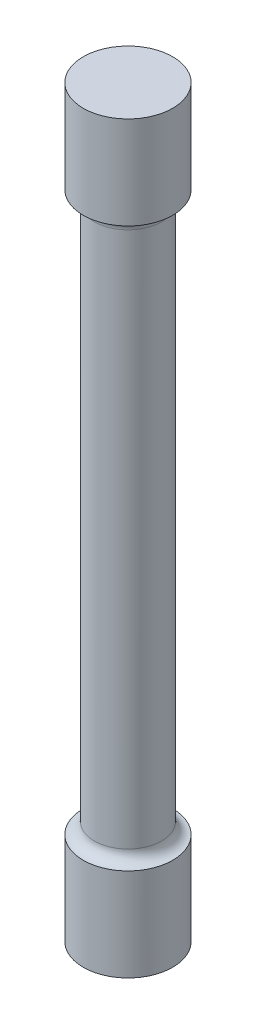
ISO-10303-21;
HEADER;
FILE_DESCRIPTION(('STEP AP214'),'2;1');
FILE_NAME('part.step','',(''),(''),'','','');
FILE_SCHEMA(('AUTOMOTIVE_DESIGN { 1 0 10303 214 1 1 1 1 }'));
ENDSEC;
DATA;
#1=APPLICATION_CONTEXT('core data for automotive mechanical design processes');
#2=APPLICATION_PROTOCOL_DEFINITION('international standard','automotive_design',2000,#1);
#3=PRODUCT_CONTEXT('',#1,'mechanical');
#4=PRODUCT('Part','Part','',(#3));
#5=PRODUCT_RELATED_PRODUCT_CATEGORY('part','',(#4));
#6=PRODUCT_DEFINITION_FORMATION('','',#4);
#7=PRODUCT_DEFINITION_CONTEXT('part definition',#1,'design');
#8=PRODUCT_DEFINITION('design','',#6,#7);
#9=PRODUCT_DEFINITION_SHAPE('','',#8);
#10=(LENGTH_UNIT() NAMED_UNIT(*) SI_UNIT(.MILLI.,.METRE.));
#11=(NAMED_UNIT(*) PLANE_ANGLE_UNIT() SI_UNIT($,.RADIAN.));
#12=(NAMED_UNIT(*) SI_UNIT($,.STERADIAN.) SOLID_ANGLE_UNIT());
#13=UNCERTAINTY_MEASURE_WITH_UNIT(LENGTH_MEASURE(1.E-05),#10,'distance_accuracy_value','');
#14=(GEOMETRIC_REPRESENTATION_CONTEXT(3) GLOBAL_UNCERTAINTY_ASSIGNED_CONTEXT((#13)) GLOBAL_UNIT_ASSIGNED_CONTEXT((#10,
#11,#12)) REPRESENTATION_CONTEXT('',''));
#15=CARTESIAN_POINT('',(0.,0.,0.));
#16=DIRECTION('',(0.,0.,1.));
#17=DIRECTION('',(1.,0.,0.));
#18=AXIS2_PLACEMENT_3D('',#15,#16,#17);
#19=CARTESIAN_POINT('',(0.,16.65,0.));
#20=DIRECTION('',(0.,-1.,0.));
#21=DIRECTION('',(0.,0.,-1.));
#22=AXIS2_PLACEMENT_3D('',#19,#20,#21);
#23=CYLINDRICAL_SURFACE('',#22,2.);
#24=CARTESIAN_POINT('',(0.,12.5,0.));
#25=DIRECTION('',(0.,1.,0.));
#26=DIRECTION('',(0.,0.,1.));
#27=AXIS2_PLACEMENT_3D('',#24,#25,#26);
#28=CIRCLE('',#27,2.);
#29=CARTESIAN_POINT('',(0.,12.5,2.));
#30=VERTEX_POINT('',#29);
#31=EDGE_CURVE('E60',#30,#30,#28,.T.);
#32=ORIENTED_EDGE('',*,*,#31,.T.);
#33=EDGE_LOOP('',(#32));
#34=FACE_BOUND('',#33,.T.);
#35=CARTESIAN_POINT('',(0.,16.65,0.));
#36=DIRECTION('',(0.,1.,0.));
#37=DIRECTION('',(0.,0.,1.));
#38=AXIS2_PLACEMENT_3D('',#35,#36,#37);
#39=CIRCLE('',#38,2.);
#40=CARTESIAN_POINT('',(0.,16.65,2.));
#41=VERTEX_POINT('',#40);
#42=EDGE_CURVE('E50',#41,#41,#39,.T.);
#43=ORIENTED_EDGE('',*,*,#42,.F.);
#44=EDGE_LOOP('',(#43));
#45=FACE_BOUND('',#44,.T.);
#46=ADVANCED_FACE('F37',(#34,#45),#23,.T.);
#47=CARTESIAN_POINT('',(0.,16.65,0.));
#48=DIRECTION('',(0.,1.,0.));
#49=DIRECTION('',(0.,0.,1.));
#50=AXIS2_PLACEMENT_3D('',#47,#48,#49);
#51=PLANE('',#50);
#52=ORIENTED_EDGE('',*,*,#42,.T.);
#53=EDGE_LOOP('',(#52));
#54=FACE_BOUND('',#53,.T.);
#55=ADVANCED_FACE('F86',(#54),#51,.T.);
#56=CARTESIAN_POINT('',(0.,12.5,0.));
#57=DIRECTION('',(0.,-1.,0.));
#58=DIRECTION('',(0.,0.,-1.));
#59=AXIS2_PLACEMENT_3D('',#56,#57,#58);
#60=CYLINDRICAL_SURFACE('',#59,1.505);
#61=CARTESIAN_POINT('',(0.,12.000025000625,0.));
#62=DIRECTION('',(0.,1.,0.));
#63=DIRECTION('',(0.,0.,1.));
#64=AXIS2_PLACEMENT_3D('',#61,#62,#63);
#65=CIRCLE('',#64,1.505);
#66=CARTESIAN_POINT('',(0.,12.000025000625,1.505));
#67=VERTEX_POINT('',#66);
#68=EDGE_CURVE('E10',#67,#67,#65,.F.);
#69=ORIENTED_EDGE('',*,*,#68,.T.);
#70=EDGE_LOOP('',(#69));
#71=FACE_BOUND('',#70,.T.);
#72=CARTESIAN_POINT('',(0.,-12.000025000625,0.));
#73=DIRECTION('',(0.,-1.,0.));
#74=DIRECTION('',(0.,0.,-1.));
#75=AXIS2_PLACEMENT_3D('',#72,#73,#74);
#76=CIRCLE('',#75,1.505);
#77=CARTESIAN_POINT('',(0.,-12.000025000625,-1.505));
#78=VERTEX_POINT('',#77);
#79=EDGE_CURVE('E45',#78,#78,#76,.F.);
#80=ORIENTED_EDGE('',*,*,#79,.T.);
#81=EDGE_LOOP('',(#80));
#82=FACE_BOUND('',#81,.T.);
#83=ADVANCED_FACE('F82',(#71,#82),#60,.T.);
#84=CARTESIAN_POINT('',(0.,-16.65,0.));
#85=DIRECTION('',(0.,1.,0.));
#86=DIRECTION('',(0.,0.,1.));
#87=AXIS2_PLACEMENT_3D('',#84,#85,#86);
#88=PLANE('',#87);
#89=CARTESIAN_POINT('',(0.,-16.65,0.));
#90=DIRECTION('',(0.,1.,0.));
#91=DIRECTION('',(0.,0.,1.));
#92=AXIS2_PLACEMENT_3D('',#89,#90,#91);
#93=CIRCLE('',#92,2.);
#94=CARTESIAN_POINT('',(0.,-16.65,2.));
#95=VERTEX_POINT('',#94);
#96=EDGE_CURVE('E55',#95,#95,#93,.T.);
#97=ORIENTED_EDGE('',*,*,#96,.F.);
#98=EDGE_LOOP('',(#97));
#99=FACE_BOUND('',#98,.T.);
#100=ADVANCED_FACE('F75',(#99),#88,.F.);
#101=ORIENTED_EDGE('',*,*,#96,.T.);
#102=EDGE_LOOP('',(#101));
#103=FACE_BOUND('',#102,.T.);
#104=CARTESIAN_POINT('',(0.,-12.5,0.));
#105=DIRECTION('',(0.,1.,0.));
#106=DIRECTION('',(0.,0.,1.));
#107=AXIS2_PLACEMENT_3D('',#104,#105,#106);
#108=CIRCLE('',#107,2.);
#109=CARTESIAN_POINT('',(0.,-12.5,2.));
#110=VERTEX_POINT('',#109);
#111=EDGE_CURVE('E65',#110,#110,#108,.T.);
#112=ORIENTED_EDGE('',*,*,#111,.F.);
#113=EDGE_LOOP('',(#112));
#114=FACE_BOUND('',#113,.T.);
#115=ADVANCED_FACE('F73',(#103,#114),#23,.T.);
#116=CARTESIAN_POINT('',(0.,-12.000025000625,0.));
#117=DIRECTION('',(0.,-1.,0.));
#118=DIRECTION('',(0.,0.,-1.));
#119=AXIS2_PLACEMENT_3D('',#116,#117,#118);
#120=TOROIDAL_SURFACE('',#119,2.005,0.5);
#121=ORIENTED_EDGE('',*,*,#111,.T.);
#122=EDGE_LOOP('',(#121));
#123=FACE_BOUND('',#122,.T.);
#124=ORIENTED_EDGE('',*,*,#79,.F.);
#125=EDGE_LOOP('',(#124));
#126=FACE_BOUND('',#125,.T.);
#127=ADVANCED_FACE('F70',(#123,#126),#120,.F.);
#128=CARTESIAN_POINT('',(0.,12.000025000625,0.));
#129=DIRECTION('',(0.,1.,0.));
#130=DIRECTION('',(0.,0.,1.));
#131=AXIS2_PLACEMENT_3D('',#128,#129,#130);
#132=TOROIDAL_SURFACE('',#131,2.005,0.5);
#133=ORIENTED_EDGE('',*,*,#68,.F.);
#134=EDGE_LOOP('',(#133));
#135=FACE_BOUND('',#134,.T.);
#136=ORIENTED_EDGE('',*,*,#31,.F.);
#137=EDGE_LOOP('',(#136));
#138=FACE_BOUND('',#137,.T.);
#139=ADVANCED_FACE('F39',(#135,#138),#132,.F.);
#140=CLOSED_SHELL('',(#46,#55,#83,#100,#115,#127,#139));
#141=MANIFOLD_SOLID_BREP('B2',#140);
#142=ADVANCED_BREP_SHAPE_REPRESENTATION('',(#18,#141),#14);
#143=SHAPE_DEFINITION_REPRESENTATION(#9,#142);
ENDSEC;
END-ISO-10303-21;
